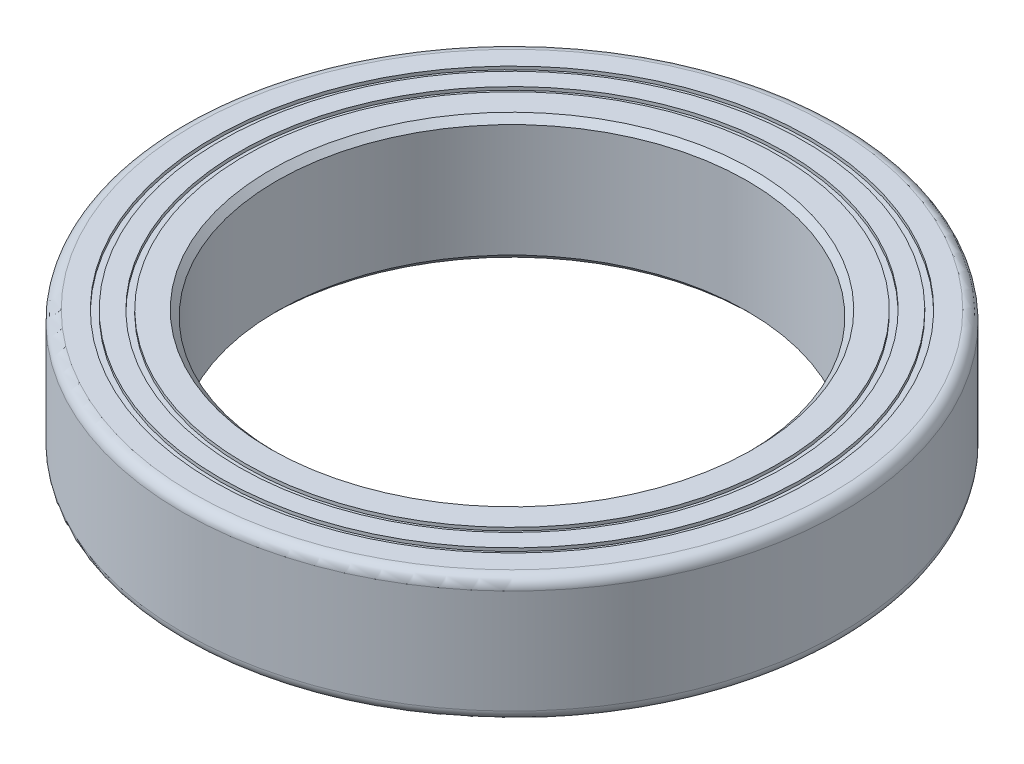
ISO-10303-21;
HEADER;
FILE_DESCRIPTION(('STEP AP214'),'2;1');
FILE_NAME('part.step','',(''),(''),'','','');
FILE_SCHEMA(('AUTOMOTIVE_DESIGN { 1 0 10303 214 1 1 1 1 }'));
ENDSEC;
DATA;
#1=APPLICATION_CONTEXT('core data for automotive mechanical design processes');
#2=APPLICATION_PROTOCOL_DEFINITION('international standard','automotive_design',2000,#1);
#3=PRODUCT_CONTEXT('',#1,'mechanical');
#4=PRODUCT('Part','Part','',(#3));
#5=PRODUCT_RELATED_PRODUCT_CATEGORY('part','',(#4));
#6=PRODUCT_DEFINITION_FORMATION('','',#4);
#7=PRODUCT_DEFINITION_CONTEXT('part definition',#1,'design');
#8=PRODUCT_DEFINITION('design','',#6,#7);
#9=PRODUCT_DEFINITION_SHAPE('','',#8);
#10=(LENGTH_UNIT() NAMED_UNIT(*) SI_UNIT(.MILLI.,.METRE.));
#11=(NAMED_UNIT(*) PLANE_ANGLE_UNIT() SI_UNIT($,.RADIAN.));
#12=(NAMED_UNIT(*) SI_UNIT($,.STERADIAN.) SOLID_ANGLE_UNIT());
#13=UNCERTAINTY_MEASURE_WITH_UNIT(LENGTH_MEASURE(1.E-05),#10,'distance_accuracy_value','');
#14=(GEOMETRIC_REPRESENTATION_CONTEXT(3) GLOBAL_UNCERTAINTY_ASSIGNED_CONTEXT((#13)) GLOBAL_UNIT_ASSIGNED_CONTEXT((#10,
#11,#12)) REPRESENTATION_CONTEXT('',''));
#15=CARTESIAN_POINT('',(0.,0.,0.));
#16=DIRECTION('',(0.,0.,1.));
#17=DIRECTION('',(1.,0.,0.));
#18=AXIS2_PLACEMENT_3D('',#15,#16,#17);
#19=CARTESIAN_POINT('',(10.5,0.,0.));
#20=DIRECTION('',(0.,1.,0.));
#21=DIRECTION('',(0.,0.,1.));
#22=AXIS2_PLACEMENT_3D('',#19,#20,#21);
#23=PLANE('',#22);
#24=CARTESIAN_POINT('',(0.,0.,0.));
#25=DIRECTION('',(0.,1.,0.));
#26=DIRECTION('',(0.,0.,1.));
#27=AXIS2_PLACEMENT_3D('',#24,#25,#26);
#28=CIRCLE('',#27,10.156);
#29=CARTESIAN_POINT('',(0.,0.,10.156));
#30=VERTEX_POINT('',#29);
#31=EDGE_CURVE('E69',#30,#30,#28,.F.);
#32=ORIENTED_EDGE('',*,*,#31,.T.);
#33=EDGE_LOOP('',(#32));
#34=FACE_BOUND('',#33,.T.);
#35=CARTESIAN_POINT('',(0.,0.,0.));
#36=DIRECTION('',(0.,1.,0.));
#37=DIRECTION('',(0.,0.,1.));
#38=AXIS2_PLACEMENT_3D('',#35,#36,#37);
#39=CIRCLE('',#38,9.5);
#40=CARTESIAN_POINT('',(0.,0.,9.5));
#41=VERTEX_POINT('',#40);
#42=EDGE_CURVE('E78',#41,#41,#39,.T.);
#43=ORIENTED_EDGE('',*,*,#42,.T.);
#44=EDGE_LOOP('',(#43));
#45=FACE_BOUND('',#44,.T.);
#46=ADVANCED_FACE('F45',(#34,#45),#23,.F.);
#47=CARTESIAN_POINT('',(0.,2.,0.));
#48=DIRECTION('',(0.,1.,0.));
#49=DIRECTION('',(0.,0.,1.));
#50=AXIS2_PLACEMENT_3D('',#47,#48,#49);
#51=CYLINDRICAL_SURFACE('',#50,9.5);
#52=ORIENTED_EDGE('',*,*,#42,.F.);
#53=EDGE_LOOP('',(#52));
#54=FACE_BOUND('',#53,.T.);
#55=CARTESIAN_POINT('',(0.,0.1,0.));
#56=DIRECTION('',(0.,1.,0.));
#57=DIRECTION('',(0.,0.,1.));
#58=AXIS2_PLACEMENT_3D('',#55,#56,#57);
#59=CIRCLE('',#58,9.5);
#60=CARTESIAN_POINT('',(0.,0.1,9.5));
#61=VERTEX_POINT('',#60);
#62=EDGE_CURVE('E81',#61,#61,#59,.T.);
#63=ORIENTED_EDGE('',*,*,#62,.T.);
#64=EDGE_LOOP('',(#63));
#65=FACE_BOUND('',#64,.T.);
#66=ADVANCED_FACE('F145',(#54,#65),#51,.F.);
#67=CARTESIAN_POINT('',(9.5,0.1,0.));
#68=DIRECTION('',(0.,1.,0.));
#69=DIRECTION('',(0.,0.,1.));
#70=AXIS2_PLACEMENT_3D('',#67,#68,#69);
#71=PLANE('',#70);
#72=ORIENTED_EDGE('',*,*,#62,.F.);
#73=EDGE_LOOP('',(#72));
#74=FACE_BOUND('',#73,.T.);
#75=CARTESIAN_POINT('',(0.,0.1,0.));
#76=DIRECTION('',(0.,1.,0.));
#77=DIRECTION('',(0.,0.,1.));
#78=AXIS2_PLACEMENT_3D('',#75,#76,#77);
#79=CIRCLE('',#78,9.3);
#80=CARTESIAN_POINT('',(0.,0.1,9.3));
#81=VERTEX_POINT('',#80);
#82=EDGE_CURVE('E84',#81,#81,#79,.T.);
#83=ORIENTED_EDGE('',*,*,#82,.T.);
#84=EDGE_LOOP('',(#83));
#85=FACE_BOUND('',#84,.T.);
#86=ADVANCED_FACE('F151',(#74,#85),#71,.F.);
#87=CARTESIAN_POINT('',(0.,2.,0.));
#88=DIRECTION('',(0.,1.,0.));
#89=DIRECTION('',(0.,0.,1.));
#90=AXIS2_PLACEMENT_3D('',#87,#88,#89);
#91=CYLINDRICAL_SURFACE('',#90,9.3);
#92=ORIENTED_EDGE('',*,*,#82,.F.);
#93=EDGE_LOOP('',(#92));
#94=FACE_BOUND('',#93,.T.);
#95=CARTESIAN_POINT('',(0.,0.,0.));
#96=DIRECTION('',(0.,1.,0.));
#97=DIRECTION('',(0.,0.,1.));
#98=AXIS2_PLACEMENT_3D('',#95,#96,#97);
#99=CIRCLE('',#98,9.3);
#100=CARTESIAN_POINT('',(0.,0.,9.3));
#101=VERTEX_POINT('',#100);
#102=EDGE_CURVE('E87',#101,#101,#99,.T.);
#103=ORIENTED_EDGE('',*,*,#102,.T.);
#104=EDGE_LOOP('',(#103));
#105=FACE_BOUND('',#104,.T.);
#106=ADVANCED_FACE('F205',(#94,#105),#91,.T.);
#107=CARTESIAN_POINT('',(8.7,0.,0.));
#108=DIRECTION('',(0.,1.,0.));
#109=DIRECTION('',(0.,0.,1.));
#110=AXIS2_PLACEMENT_3D('',#107,#108,#109);
#111=PLANE('',#110);
#112=ORIENTED_EDGE('',*,*,#102,.F.);
#113=EDGE_LOOP('',(#112));
#114=FACE_BOUND('',#113,.T.);
#115=CARTESIAN_POINT('',(0.,0.,0.));
#116=DIRECTION('',(0.,1.,0.));
#117=DIRECTION('',(0.,0.,1.));
#118=AXIS2_PLACEMENT_3D('',#115,#116,#117);
#119=CIRCLE('',#118,8.7);
#120=CARTESIAN_POINT('',(0.,0.,8.7));
#121=VERTEX_POINT('',#120);
#122=EDGE_CURVE('E90',#121,#121,#119,.T.);
#123=ORIENTED_EDGE('',*,*,#122,.T.);
#124=EDGE_LOOP('',(#123));
#125=FACE_BOUND('',#124,.T.);
#126=ADVANCED_FACE('F201',(#114,#125),#111,.F.);
#127=CARTESIAN_POINT('',(0.,2.,0.));
#128=DIRECTION('',(0.,1.,0.));
#129=DIRECTION('',(0.,0.,1.));
#130=AXIS2_PLACEMENT_3D('',#127,#128,#129);
#131=CYLINDRICAL_SURFACE('',#130,8.7);
#132=ORIENTED_EDGE('',*,*,#122,.F.);
#133=EDGE_LOOP('',(#132));
#134=FACE_BOUND('',#133,.T.);
#135=CARTESIAN_POINT('',(0.,0.1,0.));
#136=DIRECTION('',(0.,1.,0.));
#137=DIRECTION('',(0.,0.,1.));
#138=AXIS2_PLACEMENT_3D('',#135,#136,#137);
#139=CIRCLE('',#138,8.7);
#140=CARTESIAN_POINT('',(0.,0.1,8.7));
#141=VERTEX_POINT('',#140);
#142=EDGE_CURVE('E93',#141,#141,#139,.T.);
#143=ORIENTED_EDGE('',*,*,#142,.T.);
#144=EDGE_LOOP('',(#143));
#145=FACE_BOUND('',#144,.T.);
#146=ADVANCED_FACE('F193',(#134,#145),#131,.F.);
#147=CARTESIAN_POINT('',(8.5,0.1,0.));
#148=DIRECTION('',(0.,1.,0.));
#149=DIRECTION('',(0.,0.,1.));
#150=AXIS2_PLACEMENT_3D('',#147,#148,#149);
#151=PLANE('',#150);
#152=ORIENTED_EDGE('',*,*,#142,.F.);
#153=EDGE_LOOP('',(#152));
#154=FACE_BOUND('',#153,.T.);
#155=CARTESIAN_POINT('',(0.,0.1,0.));
#156=DIRECTION('',(0.,1.,0.));
#157=DIRECTION('',(0.,0.,1.));
#158=AXIS2_PLACEMENT_3D('',#155,#156,#157);
#159=CIRCLE('',#158,8.5);
#160=CARTESIAN_POINT('',(0.,0.1,8.5));
#161=VERTEX_POINT('',#160);
#162=EDGE_CURVE('E96',#161,#161,#159,.T.);
#163=ORIENTED_EDGE('',*,*,#162,.T.);
#164=EDGE_LOOP('',(#163));
#165=FACE_BOUND('',#164,.T.);
#166=ADVANCED_FACE('F186',(#154,#165),#151,.F.);
#167=CARTESIAN_POINT('',(0.,2.,0.));
#168=DIRECTION('',(0.,1.,0.));
#169=DIRECTION('',(0.,0.,1.));
#170=AXIS2_PLACEMENT_3D('',#167,#168,#169);
#171=CYLINDRICAL_SURFACE('',#170,8.5);
#172=ORIENTED_EDGE('',*,*,#162,.F.);
#173=EDGE_LOOP('',(#172));
#174=FACE_BOUND('',#173,.T.);
#175=CARTESIAN_POINT('',(0.,0.,0.));
#176=DIRECTION('',(0.,1.,0.));
#177=DIRECTION('',(0.,0.,1.));
#178=AXIS2_PLACEMENT_3D('',#175,#176,#177);
#179=CIRCLE('',#178,8.5);
#180=CARTESIAN_POINT('',(0.,0.,8.5));
#181=VERTEX_POINT('',#180);
#182=EDGE_CURVE('E99',#181,#181,#179,.T.);
#183=ORIENTED_EDGE('',*,*,#182,.T.);
#184=EDGE_LOOP('',(#183));
#185=FACE_BOUND('',#184,.T.);
#186=ADVANCED_FACE('F181',(#174,#185),#171,.T.);
#187=CARTESIAN_POINT('',(7.5,0.,0.));
#188=DIRECTION('',(0.,1.,0.));
#189=DIRECTION('',(0.,0.,1.));
#190=AXIS2_PLACEMENT_3D('',#187,#188,#189);
#191=PLANE('',#190);
#192=CARTESIAN_POINT('',(0.,0.,0.));
#193=DIRECTION('',(0.,1.,0.));
#194=DIRECTION('',(0.,0.,1.));
#195=AXIS2_PLACEMENT_3D('',#192,#193,#194);
#196=CIRCLE('',#195,7.7);
#197=CARTESIAN_POINT('',(0.,0.,7.7));
#198=VERTEX_POINT('',#197);
#199=EDGE_CURVE('E61',#198,#198,#196,.T.);
#200=ORIENTED_EDGE('',*,*,#199,.T.);
#201=EDGE_LOOP('',(#200));
#202=FACE_BOUND('',#201,.T.);
#203=ORIENTED_EDGE('',*,*,#182,.F.);
#204=EDGE_LOOP('',(#203));
#205=FACE_BOUND('',#204,.T.);
#206=ADVANCED_FACE('F177',(#202,#205),#191,.F.);
#207=CARTESIAN_POINT('',(0.,2.,0.));
#208=DIRECTION('',(0.,1.,0.));
#209=DIRECTION('',(0.,0.,1.));
#210=AXIS2_PLACEMENT_3D('',#207,#208,#209);
#211=CYLINDRICAL_SURFACE('',#210,7.5);
#212=CARTESIAN_POINT('',(0.,0.200000000000004,0.));
#213=DIRECTION('',(0.,1.,0.));
#214=DIRECTION('',(0.,0.,1.));
#215=AXIS2_PLACEMENT_3D('',#212,#213,#214);
#216=CIRCLE('',#215,7.5);
#217=CARTESIAN_POINT('',(0.,0.200000000000004,7.5));
#218=VERTEX_POINT('',#217);
#219=EDGE_CURVE('E53',#218,#218,#216,.F.);
#220=ORIENTED_EDGE('',*,*,#219,.T.);
#221=EDGE_LOOP('',(#220));
#222=FACE_BOUND('',#221,.T.);
#223=CARTESIAN_POINT('',(0.,3.80000000000001,0.));
#224=DIRECTION('',(0.,-1.,0.));
#225=DIRECTION('',(0.,0.,-1.));
#226=AXIS2_PLACEMENT_3D('',#223,#224,#225);
#227=CIRCLE('',#226,7.5);
#228=CARTESIAN_POINT('',(0.,3.80000000000001,7.5));
#229=VERTEX_POINT('',#228);
#230=EDGE_CURVE('E57',#229,#229,#227,.F.);
#231=ORIENTED_EDGE('',*,*,#230,.T.);
#232=EDGE_LOOP('',(#231));
#233=FACE_BOUND('',#232,.T.);
#234=ADVANCED_FACE('F180',(#222,#233),#211,.F.);
#235=CARTESIAN_POINT('',(7.5,4.,0.));
#236=DIRECTION('',(0.,-1.,0.));
#237=DIRECTION('',(0.,0.,-1.));
#238=AXIS2_PLACEMENT_3D('',#235,#236,#237);
#239=PLANE('',#238);
#240=CARTESIAN_POINT('',(0.,4.,0.));
#241=DIRECTION('',(0.,-1.,0.));
#242=DIRECTION('',(0.,0.,-1.));
#243=AXIS2_PLACEMENT_3D('',#240,#241,#242);
#244=CIRCLE('',#243,7.69999999999999);
#245=CARTESIAN_POINT('',(0.,4.,7.7));
#246=VERTEX_POINT('',#245);
#247=EDGE_CURVE('E10',#246,#246,#244,.T.);
#248=ORIENTED_EDGE('',*,*,#247,.T.);
#249=EDGE_LOOP('',(#248));
#250=FACE_BOUND('',#249,.T.);
#251=CARTESIAN_POINT('',(0.,4.,0.));
#252=DIRECTION('',(0.,1.,0.));
#253=DIRECTION('',(0.,0.,1.));
#254=AXIS2_PLACEMENT_3D('',#251,#252,#253);
#255=CIRCLE('',#254,8.5);
#256=CARTESIAN_POINT('',(0.,4.,8.5));
#257=VERTEX_POINT('',#256);
#258=EDGE_CURVE('E102',#257,#257,#255,.T.);
#259=ORIENTED_EDGE('',*,*,#258,.T.);
#260=EDGE_LOOP('',(#259));
#261=FACE_BOUND('',#260,.T.);
#262=ADVANCED_FACE('F272',(#250,#261),#239,.F.);
#263=CARTESIAN_POINT('',(0.,2.,0.));
#264=DIRECTION('',(0.,1.,0.));
#265=DIRECTION('',(0.,0.,1.));
#266=AXIS2_PLACEMENT_3D('',#263,#264,#265);
#267=CYLINDRICAL_SURFACE('',#266,8.5);
#268=ORIENTED_EDGE('',*,*,#258,.F.);
#269=EDGE_LOOP('',(#268));
#270=FACE_BOUND('',#269,.T.);
#271=CARTESIAN_POINT('',(0.,3.9,0.));
#272=DIRECTION('',(0.,1.,0.));
#273=DIRECTION('',(0.,0.,1.));
#274=AXIS2_PLACEMENT_3D('',#271,#272,#273);
#275=CIRCLE('',#274,8.5);
#276=CARTESIAN_POINT('',(0.,3.9,8.5));
#277=VERTEX_POINT('',#276);
#278=EDGE_CURVE('E105',#277,#277,#275,.T.);
#279=ORIENTED_EDGE('',*,*,#278,.T.);
#280=EDGE_LOOP('',(#279));
#281=FACE_BOUND('',#280,.T.);
#282=ADVANCED_FACE('F279',(#270,#281),#267,.T.);
#283=CARTESIAN_POINT('',(8.5,3.9,0.));
#284=DIRECTION('',(0.,-1.,0.));
#285=DIRECTION('',(0.,0.,-1.));
#286=AXIS2_PLACEMENT_3D('',#283,#284,#285);
#287=PLANE('',#286);
#288=ORIENTED_EDGE('',*,*,#278,.F.);
#289=EDGE_LOOP('',(#288));
#290=FACE_BOUND('',#289,.T.);
#291=CARTESIAN_POINT('',(0.,3.9,0.));
#292=DIRECTION('',(0.,1.,0.));
#293=DIRECTION('',(0.,0.,1.));
#294=AXIS2_PLACEMENT_3D('',#291,#292,#293);
#295=CIRCLE('',#294,8.7);
#296=CARTESIAN_POINT('',(0.,3.9,8.7));
#297=VERTEX_POINT('',#296);
#298=EDGE_CURVE('E108',#297,#297,#295,.T.);
#299=ORIENTED_EDGE('',*,*,#298,.T.);
#300=EDGE_LOOP('',(#299));
#301=FACE_BOUND('',#300,.T.);
#302=ADVANCED_FACE('F287',(#290,#301),#287,.F.);
#303=CARTESIAN_POINT('',(0.,2.,0.));
#304=DIRECTION('',(0.,1.,0.));
#305=DIRECTION('',(0.,0.,1.));
#306=AXIS2_PLACEMENT_3D('',#303,#304,#305);
#307=CYLINDRICAL_SURFACE('',#306,8.7);
#308=ORIENTED_EDGE('',*,*,#298,.F.);
#309=EDGE_LOOP('',(#308));
#310=FACE_BOUND('',#309,.T.);
#311=CARTESIAN_POINT('',(0.,4.,0.));
#312=DIRECTION('',(0.,1.,0.));
#313=DIRECTION('',(0.,0.,1.));
#314=AXIS2_PLACEMENT_3D('',#311,#312,#313);
#315=CIRCLE('',#314,8.7);
#316=CARTESIAN_POINT('',(0.,4.,8.7));
#317=VERTEX_POINT('',#316);
#318=EDGE_CURVE('E111',#317,#317,#315,.T.);
#319=ORIENTED_EDGE('',*,*,#318,.T.);
#320=EDGE_LOOP('',(#319));
#321=FACE_BOUND('',#320,.T.);
#322=ADVANCED_FACE('F297',(#310,#321),#307,.F.);
#323=CARTESIAN_POINT('',(8.7,4.,0.));
#324=DIRECTION('',(0.,-1.,0.));
#325=DIRECTION('',(0.,0.,-1.));
#326=AXIS2_PLACEMENT_3D('',#323,#324,#325);
#327=PLANE('',#326);
#328=ORIENTED_EDGE('',*,*,#318,.F.);
#329=EDGE_LOOP('',(#328));
#330=FACE_BOUND('',#329,.T.);
#331=CARTESIAN_POINT('',(0.,4.,0.));
#332=DIRECTION('',(0.,1.,0.));
#333=DIRECTION('',(0.,0.,1.));
#334=AXIS2_PLACEMENT_3D('',#331,#332,#333);
#335=CIRCLE('',#334,9.3);
#336=CARTESIAN_POINT('',(0.,4.,9.3));
#337=VERTEX_POINT('',#336);
#338=EDGE_CURVE('E114',#337,#337,#335,.T.);
#339=ORIENTED_EDGE('',*,*,#338,.T.);
#340=EDGE_LOOP('',(#339));
#341=FACE_BOUND('',#340,.T.);
#342=ADVANCED_FACE('F307',(#330,#341),#327,.F.);
#343=CARTESIAN_POINT('',(0.,2.,0.));
#344=DIRECTION('',(0.,1.,0.));
#345=DIRECTION('',(0.,0.,1.));
#346=AXIS2_PLACEMENT_3D('',#343,#344,#345);
#347=CYLINDRICAL_SURFACE('',#346,9.3);
#348=ORIENTED_EDGE('',*,*,#338,.F.);
#349=EDGE_LOOP('',(#348));
#350=FACE_BOUND('',#349,.T.);
#351=CARTESIAN_POINT('',(0.,3.9,0.));
#352=DIRECTION('',(0.,1.,0.));
#353=DIRECTION('',(0.,0.,1.));
#354=AXIS2_PLACEMENT_3D('',#351,#352,#353);
#355=CIRCLE('',#354,9.3);
#356=CARTESIAN_POINT('',(0.,3.9,9.3));
#357=VERTEX_POINT('',#356);
#358=EDGE_CURVE('E117',#357,#357,#355,.T.);
#359=ORIENTED_EDGE('',*,*,#358,.T.);
#360=EDGE_LOOP('',(#359));
#361=FACE_BOUND('',#360,.T.);
#362=ADVANCED_FACE('F318',(#350,#361),#347,.T.);
#363=CARTESIAN_POINT('',(9.5,3.9,0.));
#364=DIRECTION('',(0.,-1.,0.));
#365=DIRECTION('',(0.,0.,-1.));
#366=AXIS2_PLACEMENT_3D('',#363,#364,#365);
#367=PLANE('',#366);
#368=ORIENTED_EDGE('',*,*,#358,.F.);
#369=EDGE_LOOP('',(#368));
#370=FACE_BOUND('',#369,.T.);
#371=CARTESIAN_POINT('',(0.,3.9,0.));
#372=DIRECTION('',(0.,1.,0.));
#373=DIRECTION('',(0.,0.,1.));
#374=AXIS2_PLACEMENT_3D('',#371,#372,#373);
#375=CIRCLE('',#374,9.5);
#376=CARTESIAN_POINT('',(0.,3.9,9.5));
#377=VERTEX_POINT('',#376);
#378=EDGE_CURVE('E120',#377,#377,#375,.T.);
#379=ORIENTED_EDGE('',*,*,#378,.T.);
#380=EDGE_LOOP('',(#379));
#381=FACE_BOUND('',#380,.T.);
#382=ADVANCED_FACE('F142',(#370,#381),#367,.F.);
#383=CARTESIAN_POINT('',(0.,2.,0.));
#384=DIRECTION('',(0.,1.,0.));
#385=DIRECTION('',(0.,0.,1.));
#386=AXIS2_PLACEMENT_3D('',#383,#384,#385);
#387=CYLINDRICAL_SURFACE('',#386,9.5);
#388=ORIENTED_EDGE('',*,*,#378,.F.);
#389=EDGE_LOOP('',(#388));
#390=FACE_BOUND('',#389,.T.);
#391=CARTESIAN_POINT('',(0.,4.,0.));
#392=DIRECTION('',(0.,1.,0.));
#393=DIRECTION('',(0.,0.,1.));
#394=AXIS2_PLACEMENT_3D('',#391,#392,#393);
#395=CIRCLE('',#394,9.5);
#396=CARTESIAN_POINT('',(0.,4.,9.5));
#397=VERTEX_POINT('',#396);
#398=EDGE_CURVE('E123',#397,#397,#395,.T.);
#399=ORIENTED_EDGE('',*,*,#398,.T.);
#400=EDGE_LOOP('',(#399));
#401=FACE_BOUND('',#400,.T.);
#402=ADVANCED_FACE('F127',(#390,#401),#387,.F.);
#403=CARTESIAN_POINT('',(10.5,4.,0.));
#404=DIRECTION('',(0.,-1.,0.));
#405=DIRECTION('',(0.,0.,-1.));
#406=AXIS2_PLACEMENT_3D('',#403,#404,#405);
#407=PLANE('',#406);
#408=CARTESIAN_POINT('',(0.,4.,0.));
#409=DIRECTION('',(0.,-1.,0.));
#410=DIRECTION('',(0.,0.,-1.));
#411=AXIS2_PLACEMENT_3D('',#408,#409,#410);
#412=CIRCLE('',#411,10.156);
#413=CARTESIAN_POINT('',(0.,4.,-10.156));
#414=VERTEX_POINT('',#413);
#415=EDGE_CURVE('E66',#414,#414,#412,.F.);
#416=ORIENTED_EDGE('',*,*,#415,.T.);
#417=EDGE_LOOP('',(#416));
#418=FACE_BOUND('',#417,.T.);
#419=ORIENTED_EDGE('',*,*,#398,.F.);
#420=EDGE_LOOP('',(#419));
#421=FACE_BOUND('',#420,.T.);
#422=ADVANCED_FACE('F129',(#418,#421),#407,.F.);
#423=CARTESIAN_POINT('',(0.,2.,0.));
#424=DIRECTION('',(0.,1.,0.));
#425=DIRECTION('',(0.,0.,1.));
#426=AXIS2_PLACEMENT_3D('',#423,#424,#425);
#427=CYLINDRICAL_SURFACE('',#426,10.5);
#428=CARTESIAN_POINT('',(0.,0.344,0.));
#429=DIRECTION('',(0.,1.,0.));
#430=DIRECTION('',(0.,0.,1.));
#431=AXIS2_PLACEMENT_3D('',#428,#429,#430);
#432=CIRCLE('',#431,10.5);
#433=CARTESIAN_POINT('',(0.,0.344,10.5));
#434=VERTEX_POINT('',#433);
#435=EDGE_CURVE('E72',#434,#434,#432,.T.);
#436=ORIENTED_EDGE('',*,*,#435,.T.);
#437=EDGE_LOOP('',(#436));
#438=FACE_BOUND('',#437,.T.);
#439=CARTESIAN_POINT('',(0.,3.656,0.));
#440=DIRECTION('',(0.,-1.,0.));
#441=DIRECTION('',(0.,0.,-1.));
#442=AXIS2_PLACEMENT_3D('',#439,#440,#441);
#443=CIRCLE('',#442,10.5);
#444=CARTESIAN_POINT('',(0.,3.656,-10.5));
#445=VERTEX_POINT('',#444);
#446=EDGE_CURVE('E75',#445,#445,#443,.T.);
#447=ORIENTED_EDGE('',*,*,#446,.T.);
#448=EDGE_LOOP('',(#447));
#449=FACE_BOUND('',#448,.T.);
#450=ADVANCED_FACE('F131',(#438,#449),#427,.T.);
#451=CARTESIAN_POINT('',(0.,0.344,0.));
#452=DIRECTION('',(0.,1.,0.));
#453=DIRECTION('',(0.,0.,1.));
#454=AXIS2_PLACEMENT_3D('',#451,#452,#453);
#455=TOROIDAL_SURFACE('',#454,10.156,0.344);
#456=ORIENTED_EDGE('',*,*,#31,.F.);
#457=EDGE_LOOP('',(#456));
#458=FACE_BOUND('',#457,.T.);
#459=ORIENTED_EDGE('',*,*,#435,.F.);
#460=EDGE_LOOP('',(#459));
#461=FACE_BOUND('',#460,.T.);
#462=ADVANCED_FACE('F138',(#458,#461),#455,.T.);
#463=CARTESIAN_POINT('',(0.,3.656,0.));
#464=DIRECTION('',(0.,-1.,0.));
#465=DIRECTION('',(0.,0.,-1.));
#466=AXIS2_PLACEMENT_3D('',#463,#464,#465);
#467=TOROIDAL_SURFACE('',#466,10.156,0.344);
#468=ORIENTED_EDGE('',*,*,#446,.F.);
#469=EDGE_LOOP('',(#468));
#470=FACE_BOUND('',#469,.T.);
#471=ORIENTED_EDGE('',*,*,#415,.F.);
#472=EDGE_LOOP('',(#471));
#473=FACE_BOUND('',#472,.T.);
#474=ADVANCED_FACE('F159',(#470,#473),#467,.T.);
#475=CARTESIAN_POINT('',(0.,0.,0.));
#476=DIRECTION('',(0.,-1.,0.));
#477=DIRECTION('',(0.,0.,-1.));
#478=AXIS2_PLACEMENT_3D('',#475,#476,#477);
#479=CONICAL_SURFACE('',#478,7.7,0.785398163397444);
#480=ORIENTED_EDGE('',*,*,#219,.F.);
#481=EDGE_LOOP('',(#480));
#482=FACE_BOUND('',#481,.T.);
#483=ORIENTED_EDGE('',*,*,#199,.F.);
#484=EDGE_LOOP('',(#483));
#485=FACE_BOUND('',#484,.T.);
#486=ADVANCED_FACE('F162',(#482,#485),#479,.F.);
#487=CARTESIAN_POINT('',(0.,3.80000000000001,0.));
#488=DIRECTION('',(0.,1.,0.));
#489=DIRECTION('',(0.,0.,1.));
#490=AXIS2_PLACEMENT_3D('',#487,#488,#489);
#491=CONICAL_SURFACE('',#490,7.5,0.785398163397453);
#492=CARTESIAN_POINT('',(0.,4.,7.7));
#493=CARTESIAN_POINT('',(0.,3.99791666666667,7.69791666666666));
#494=CARTESIAN_POINT('',(0.,3.99583333333333,7.69583333333333));
#495=CARTESIAN_POINT('',(0.,3.99166666666667,7.69166666666666));
#496=CARTESIAN_POINT('',(0.,3.98958333333333,7.68958333333333));
#497=CARTESIAN_POINT('',(0.,3.98541666666667,7.68541666666666));
#498=CARTESIAN_POINT('',(0.,3.98333333333333,7.68333333333333));
#499=CARTESIAN_POINT('',(0.,3.97916666666667,7.67916666666666));
#500=CARTESIAN_POINT('',(0.,3.97708333333333,7.67708333333333));
#501=CARTESIAN_POINT('',(0.,3.97291666666667,7.67291666666666));
#502=CARTESIAN_POINT('',(0.,3.97083333333333,7.67083333333333));
#503=CARTESIAN_POINT('',(0.,3.96666666666667,7.66666666666666));
#504=CARTESIAN_POINT('',(0.,3.96458333333333,7.66458333333333));
#505=CARTESIAN_POINT('',(0.,3.96041666666667,7.66041666666666));
#506=CARTESIAN_POINT('',(0.,3.95833333333334,7.65833333333333));
#507=CARTESIAN_POINT('',(0.,3.95416666666667,7.65416666666666));
#508=CARTESIAN_POINT('',(0.,3.95208333333334,7.65208333333333));
#509=CARTESIAN_POINT('',(0.,3.94791666666667,7.64791666666666));
#510=CARTESIAN_POINT('',(0.,3.94583333333334,7.64583333333333));
#511=CARTESIAN_POINT('',(0.,3.94166666666667,7.64166666666666));
#512=CARTESIAN_POINT('',(0.,3.93958333333334,7.63958333333333));
#513=CARTESIAN_POINT('',(0.,3.93541666666667,7.63541666666666));
#514=CARTESIAN_POINT('',(0.,3.93333333333334,7.63333333333333));
#515=CARTESIAN_POINT('',(0.,3.92916666666667,7.62916666666666));
#516=CARTESIAN_POINT('',(0.,3.92708333333334,7.62708333333333));
#517=CARTESIAN_POINT('',(0.,3.92291666666667,7.62291666666666));
#518=CARTESIAN_POINT('',(0.,3.92083333333334,7.62083333333333));
#519=CARTESIAN_POINT('',(0.,3.91666666666667,7.61666666666666));
#520=CARTESIAN_POINT('',(0.,3.91458333333334,7.61458333333333));
#521=CARTESIAN_POINT('',(0.,3.91041666666667,7.61041666666666));
#522=CARTESIAN_POINT('',(0.,3.90833333333334,7.60833333333333));
#523=CARTESIAN_POINT('',(0.,3.90416666666667,7.60416666666666));
#524=CARTESIAN_POINT('',(0.,3.90208333333334,7.60208333333333));
#525=CARTESIAN_POINT('',(0.,3.89791666666667,7.59791666666666));
#526=CARTESIAN_POINT('',(0.,3.89583333333334,7.59583333333333));
#527=CARTESIAN_POINT('',(0.,3.89166666666667,7.59166666666667));
#528=CARTESIAN_POINT('',(0.,3.88958333333334,7.58958333333333));
#529=CARTESIAN_POINT('',(0.,3.88541666666667,7.58541666666666));
#530=CARTESIAN_POINT('',(0.,3.88333333333334,7.58333333333333));
#531=CARTESIAN_POINT('',(0.,3.87916666666667,7.57916666666666));
#532=CARTESIAN_POINT('',(0.,3.87708333333334,7.57708333333333));
#533=CARTESIAN_POINT('',(0.,3.87291666666667,7.57291666666667));
#534=CARTESIAN_POINT('',(0.,3.87083333333334,7.57083333333333));
#535=CARTESIAN_POINT('',(0.,3.86666666666667,7.56666666666667));
#536=CARTESIAN_POINT('',(0.,3.86458333333334,7.56458333333333));
#537=CARTESIAN_POINT('',(0.,3.86041666666667,7.56041666666667));
#538=CARTESIAN_POINT('',(0.,3.85833333333334,7.55833333333333));
#539=CARTESIAN_POINT('',(0.,3.85416666666667,7.55416666666667));
#540=CARTESIAN_POINT('',(0.,3.85208333333334,7.55208333333333));
#541=CARTESIAN_POINT('',(0.,3.84791666666667,7.54791666666667));
#542=CARTESIAN_POINT('',(0.,3.84583333333334,7.54583333333333));
#543=CARTESIAN_POINT('',(0.,3.84166666666667,7.54166666666667));
#544=CARTESIAN_POINT('',(0.,3.83958333333334,7.53958333333333));
#545=CARTESIAN_POINT('',(0.,3.83541666666667,7.53541666666667));
#546=CARTESIAN_POINT('',(0.,3.83333333333334,7.53333333333333));
#547=CARTESIAN_POINT('',(0.,3.82916666666667,7.52916666666667));
#548=CARTESIAN_POINT('',(0.,3.82708333333334,7.52708333333333));
#549=CARTESIAN_POINT('',(0.,3.82291666666667,7.52291666666667));
#550=CARTESIAN_POINT('',(0.,3.82083333333334,7.52083333333333));
#551=CARTESIAN_POINT('',(0.,3.81666666666667,7.51666666666667));
#552=CARTESIAN_POINT('',(0.,3.81458333333334,7.51458333333333));
#553=CARTESIAN_POINT('',(0.,3.81041666666667,7.51041666666667));
#554=CARTESIAN_POINT('',(0.,3.80833333333334,7.50833333333333));
#555=CARTESIAN_POINT('',(0.,3.80416666666667,7.50416666666667));
#556=CARTESIAN_POINT('',(0.,3.80208333333334,7.50208333333333));
#557=CARTESIAN_POINT('',(0.,3.80000000000001,7.5));
#558=B_SPLINE_CURVE_WITH_KNOTS('',3,(#492,#493,#494,#495,#496,#497,#498,#499,#500,#501,#502,
#503,#504,#505,#506,#507,#508,#509,#510,#511,#512,#513,#514,#515,#516,#517,#518,#519,#520,#521,
#522,#523,#524,#525,#526,#527,#528,#529,#530,#531,#532,#533,#534,#535,#536,#537,#538,#539,#540,
#541,#542,#543,#544,#545,#546,#547,#548,#549,#550,#551,#552,#553,#554,#555,#556,#557),
.UNSPECIFIED.,.F.,.F.,(4,2,2,2,2,2,2,2,2,2,2,2,2,2,2,2,2,2,2,2,2,2,2,2,2,2,2,2,2,2,2,2,4),(0.,
0.0088388347648321,0.0176776695296642,0.0265165042944951,0.0353553390593272,0.0441941738241586,
0.0530330085889901,0.0618718433538216,0.0707106781186531,0.0795495128834852,0.0883883476483167,
0.0972271824131481,0.10606601717798,0.114904851942812,0.123743686707643,0.132582521472475,
0.141421356237307,0.150260191002138,0.15909902576697,0.167937860531802,0.176776695296633,
0.185615530061465,0.194454364826296,0.203293199591128,0.212132034355959,0.220970869120791,
0.229809703885623,0.238648538650454,0.247487373415286,0.256326208180117,0.265165042944949,
0.27400387770978,0.282842712474612),.UNSPECIFIED.);
#559=EDGE_CURVE('BSEAM48',#246,#229,#558,.T.);
#560=ORIENTED_EDGE('',*,*,#247,.F.);
#561=ORIENTED_EDGE('',*,*,#230,.F.);
#562=ORIENTED_EDGE('',*,*,#559,.T.);
#563=ORIENTED_EDGE('',*,*,#559,.F.);
#564=EDGE_LOOP('',(#560,#562,#561,#563));
#565=FACE_BOUND('',#564,.T.);
#566=ADVANCED_FACE('F48',(#565),#491,.F.);
#567=CLOSED_SHELL('',(#46,#66,#86,#106,#126,#146,#166,#186,#206,#234,#262,#282,#302,#322,#342,
#362,#382,#402,#422,#450,#462,#474,#486,#566));
#568=MANIFOLD_SOLID_BREP('B2',#567);
#569=ADVANCED_BREP_SHAPE_REPRESENTATION('',(#18,#568),#14);
#570=SHAPE_DEFINITION_REPRESENTATION(#9,#569);
ENDSEC;
END-ISO-10303-21;
